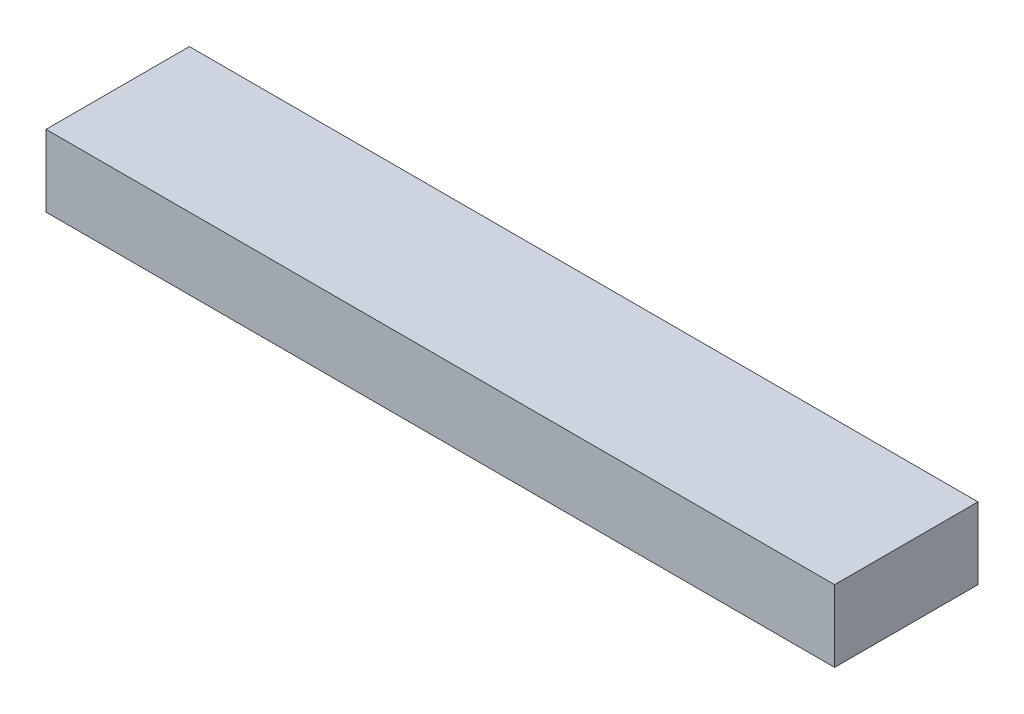
ISO-10303-21;
HEADER;
FILE_DESCRIPTION(('STEP AP214'),'2;1');
FILE_NAME('part.step','',(''),(''),'','','');
FILE_SCHEMA(('AUTOMOTIVE_DESIGN { 1 0 10303 214 1 1 1 1 }'));
ENDSEC;
DATA;
#1=APPLICATION_CONTEXT('core data for automotive mechanical design processes');
#2=APPLICATION_PROTOCOL_DEFINITION('international standard','automotive_design',2000,#1);
#3=PRODUCT_CONTEXT('',#1,'mechanical');
#4=PRODUCT('Part','Part','',(#3));
#5=PRODUCT_RELATED_PRODUCT_CATEGORY('part','',(#4));
#6=PRODUCT_DEFINITION_FORMATION('','',#4);
#7=PRODUCT_DEFINITION_CONTEXT('part definition',#1,'design');
#8=PRODUCT_DEFINITION('design','',#6,#7);
#9=PRODUCT_DEFINITION_SHAPE('','',#8);
#10=(LENGTH_UNIT() NAMED_UNIT(*) SI_UNIT(.MILLI.,.METRE.));
#11=(NAMED_UNIT(*) PLANE_ANGLE_UNIT() SI_UNIT($,.RADIAN.));
#12=(NAMED_UNIT(*) SI_UNIT($,.STERADIAN.) SOLID_ANGLE_UNIT());
#13=UNCERTAINTY_MEASURE_WITH_UNIT(LENGTH_MEASURE(1.E-05),#10,'distance_accuracy_value','');
#14=(GEOMETRIC_REPRESENTATION_CONTEXT(3) GLOBAL_UNCERTAINTY_ASSIGNED_CONTEXT((#13)) GLOBAL_UNIT_ASSIGNED_CONTEXT((#10,
#11,#12)) REPRESENTATION_CONTEXT('',''));
#15=CARTESIAN_POINT('',(0.,0.,0.));
#16=DIRECTION('',(0.,0.,1.));
#17=DIRECTION('',(1.,0.,0.));
#18=AXIS2_PLACEMENT_3D('',#15,#16,#17);
#19=CARTESIAN_POINT('',(0.,5.,0.));
#20=DIRECTION('',(-1.,0.,0.));
#21=DIRECTION('',(0.,0.,1.));
#22=AXIS2_PLACEMENT_3D('',#19,#20,#21);
#23=PLANE('',#22);
#24=DIRECTION('',(0.,0.,-1.));
#25=VECTOR('',#24,1.);
#26=CARTESIAN_POINT('',(0.,0.,0.));
#27=LINE('',#26,#25);
#28=CARTESIAN_POINT('',(0.,0.,0.));
#29=VERTEX_POINT('',#28);
#30=CARTESIAN_POINT('',(0.,0.,-10.));
#31=VERTEX_POINT('',#30);
#32=EDGE_CURVE('E95',#29,#31,#27,.T.);
#33=ORIENTED_EDGE('',*,*,#32,.T.);
#34=DIRECTION('',(0.,-1.,0.));
#35=VECTOR('',#34,1.);
#36=CARTESIAN_POINT('',(0.,5.,-10.));
#37=LINE('',#36,#35);
#38=CARTESIAN_POINT('',(0.,5.,-10.));
#39=VERTEX_POINT('',#38);
#40=EDGE_CURVE('E11',#39,#31,#37,.T.);
#41=ORIENTED_EDGE('',*,*,#40,.F.);
#42=DIRECTION('',(0.,0.,-1.));
#43=VECTOR('',#42,1.);
#44=CARTESIAN_POINT('',(0.,5.,0.));
#45=LINE('',#44,#43);
#46=CARTESIAN_POINT('',(0.,5.,0.));
#47=VERTEX_POINT('',#46);
#48=EDGE_CURVE('E83',#47,#39,#45,.T.);
#49=ORIENTED_EDGE('',*,*,#48,.F.);
#50=DIRECTION('',(0.,-1.,0.));
#51=VECTOR('',#50,1.);
#52=CARTESIAN_POINT('',(0.,5.,0.));
#53=LINE('',#52,#51);
#54=EDGE_CURVE('E91',#47,#29,#53,.T.);
#55=ORIENTED_EDGE('',*,*,#54,.T.);
#56=EDGE_LOOP('',(#33,#41,#49,#55));
#57=FACE_BOUND('',#56,.T.);
#58=ADVANCED_FACE('F32',(#57),#23,.F.);
#59=CARTESIAN_POINT('',(0.,5.,-10.));
#60=DIRECTION('',(0.,0.,1.));
#61=DIRECTION('',(1.,0.,0.));
#62=AXIS2_PLACEMENT_3D('',#59,#60,#61);
#63=PLANE('',#62);
#64=DIRECTION('',(-1.,0.,0.));
#65=VECTOR('',#64,1.);
#66=CARTESIAN_POINT('',(0.,0.,-10.));
#67=LINE('',#66,#65);
#68=CARTESIAN_POINT('',(-55.,0.,-9.99999999999999));
#69=VERTEX_POINT('',#68);
#70=EDGE_CURVE('E87',#31,#69,#67,.T.);
#71=ORIENTED_EDGE('',*,*,#70,.T.);
#72=DIRECTION('',(0.,-1.,0.));
#73=VECTOR('',#72,1.);
#74=CARTESIAN_POINT('',(-55.,5.,-9.99999999999999));
#75=LINE('',#74,#73);
#76=CARTESIAN_POINT('',(-55.,5.,-9.99999999999999));
#77=VERTEX_POINT('',#76);
#78=EDGE_CURVE('E40',#77,#69,#75,.T.);
#79=ORIENTED_EDGE('',*,*,#78,.F.);
#80=DIRECTION('',(-1.,0.,0.));
#81=VECTOR('',#80,1.);
#82=CARTESIAN_POINT('',(0.,5.,-10.));
#83=LINE('',#82,#81);
#84=EDGE_CURVE('E78',#39,#77,#83,.T.);
#85=ORIENTED_EDGE('',*,*,#84,.F.);
#86=ORIENTED_EDGE('',*,*,#40,.T.);
#87=EDGE_LOOP('',(#71,#79,#85,#86));
#88=FACE_BOUND('',#87,.T.);
#89=ADVANCED_FACE('F86',(#88),#63,.F.);
#90=CARTESIAN_POINT('',(-55.,5.,0.));
#91=DIRECTION('',(1.,0.,0.));
#92=DIRECTION('',(0.,0.,-1.));
#93=AXIS2_PLACEMENT_3D('',#90,#91,#92);
#94=PLANE('',#93);
#95=DIRECTION('',(0.,0.,1.));
#96=VECTOR('',#95,1.);
#97=CARTESIAN_POINT('',(-55.,0.,0.));
#98=LINE('',#97,#96);
#99=CARTESIAN_POINT('',(-55.,0.,0.));
#100=VERTEX_POINT('',#99);
#101=EDGE_CURVE('E65',#69,#100,#98,.T.);
#102=ORIENTED_EDGE('',*,*,#101,.T.);
#103=DIRECTION('',(0.,-1.,0.));
#104=VECTOR('',#103,1.);
#105=CARTESIAN_POINT('',(-55.,5.,0.));
#106=LINE('',#105,#104);
#107=CARTESIAN_POINT('',(-55.,5.,0.));
#108=VERTEX_POINT('',#107);
#109=EDGE_CURVE('E88',#108,#100,#106,.T.);
#110=ORIENTED_EDGE('',*,*,#109,.F.);
#111=DIRECTION('',(0.,0.,1.));
#112=VECTOR('',#111,1.);
#113=CARTESIAN_POINT('',(-55.,5.,0.));
#114=LINE('',#113,#112);
#115=EDGE_CURVE('E81',#77,#108,#114,.T.);
#116=ORIENTED_EDGE('',*,*,#115,.F.);
#117=ORIENTED_EDGE('',*,*,#78,.T.);
#118=EDGE_LOOP('',(#102,#110,#116,#117));
#119=FACE_BOUND('',#118,.T.);
#120=ADVANCED_FACE('F89',(#119),#94,.F.);
#121=CARTESIAN_POINT('',(0.,5.,0.));
#122=DIRECTION('',(0.,0.,-1.));
#123=DIRECTION('',(-1.,0.,0.));
#124=AXIS2_PLACEMENT_3D('',#121,#122,#123);
#125=PLANE('',#124);
#126=DIRECTION('',(1.,0.,0.));
#127=VECTOR('',#126,1.);
#128=CARTESIAN_POINT('',(0.,0.,0.));
#129=LINE('',#128,#127);
#130=EDGE_CURVE('E71',#100,#29,#129,.T.);
#131=ORIENTED_EDGE('',*,*,#130,.T.);
#132=ORIENTED_EDGE('',*,*,#54,.F.);
#133=DIRECTION('',(1.,0.,0.));
#134=VECTOR('',#133,1.);
#135=CARTESIAN_POINT('',(0.,5.,0.));
#136=LINE('',#135,#134);
#137=EDGE_CURVE('E48',#108,#47,#136,.T.);
#138=ORIENTED_EDGE('',*,*,#137,.F.);
#139=ORIENTED_EDGE('',*,*,#109,.T.);
#140=EDGE_LOOP('',(#131,#132,#138,#139));
#141=FACE_BOUND('',#140,.T.);
#142=ADVANCED_FACE('F102',(#141),#125,.F.);
#143=CARTESIAN_POINT('',(0.,5.,0.));
#144=DIRECTION('',(0.,1.,0.));
#145=DIRECTION('',(0.,0.,1.));
#146=AXIS2_PLACEMENT_3D('',#143,#144,#145);
#147=PLANE('',#146);
#148=ORIENTED_EDGE('',*,*,#48,.T.);
#149=ORIENTED_EDGE('',*,*,#84,.T.);
#150=ORIENTED_EDGE('',*,*,#115,.T.);
#151=ORIENTED_EDGE('',*,*,#137,.T.);
#152=EDGE_LOOP('',(#148,#149,#150,#151));
#153=FACE_BOUND('',#152,.T.);
#154=ADVANCED_FACE('F79',(#153),#147,.T.);
#155=CARTESIAN_POINT('',(0.,0.,0.));
#156=DIRECTION('',(0.,1.,0.));
#157=DIRECTION('',(0.,0.,1.));
#158=AXIS2_PLACEMENT_3D('',#155,#156,#157);
#159=PLANE('',#158);
#160=ORIENTED_EDGE('',*,*,#32,.F.);
#161=ORIENTED_EDGE('',*,*,#130,.F.);
#162=ORIENTED_EDGE('',*,*,#101,.F.);
#163=ORIENTED_EDGE('',*,*,#70,.F.);
#164=EDGE_LOOP('',(#160,#161,#162,#163));
#165=FACE_BOUND('',#164,.T.);
#166=ADVANCED_FACE('F105',(#165),#159,.F.);
#167=CLOSED_SHELL('',(#58,#89,#120,#142,#154,#166));
#168=MANIFOLD_SOLID_BREP('B2',#167);
#169=ADVANCED_BREP_SHAPE_REPRESENTATION('',(#18,#168),#14);
#170=SHAPE_DEFINITION_REPRESENTATION(#9,#169);
ENDSEC;
END-ISO-10303-21;
